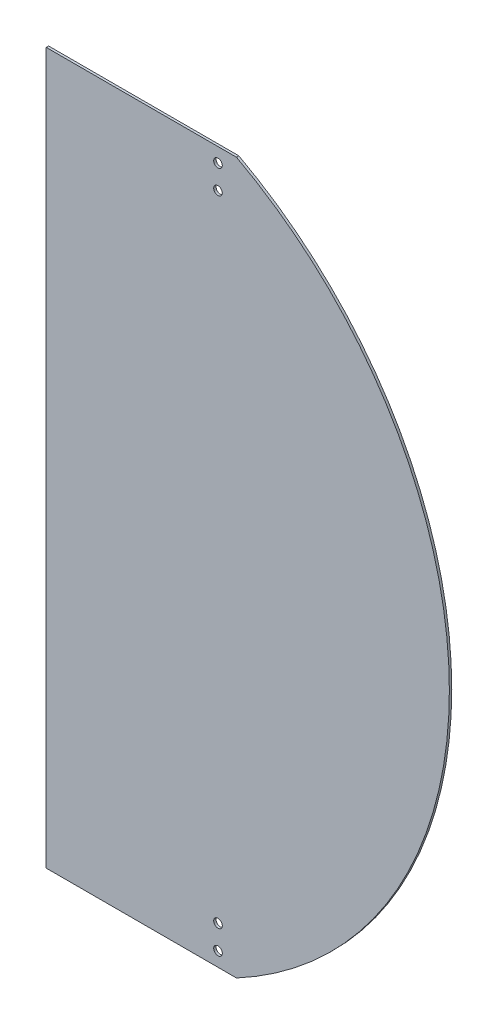
ISO-10303-21;
HEADER;
FILE_DESCRIPTION(('STEP AP214'),'2;1');
FILE_NAME('part.step','',(''),(''),'','','');
FILE_SCHEMA(('AUTOMOTIVE_DESIGN { 1 0 10303 214 1 1 1 1 }'));
ENDSEC;
DATA;
#1=APPLICATION_CONTEXT('core data for automotive mechanical design processes');
#2=APPLICATION_PROTOCOL_DEFINITION('international standard','automotive_design',2000,#1);
#3=PRODUCT_CONTEXT('',#1,'mechanical');
#4=PRODUCT('Part','Part','',(#3));
#5=PRODUCT_RELATED_PRODUCT_CATEGORY('part','',(#4));
#6=PRODUCT_DEFINITION_FORMATION('','',#4);
#7=PRODUCT_DEFINITION_CONTEXT('part definition',#1,'design');
#8=PRODUCT_DEFINITION('design','',#6,#7);
#9=PRODUCT_DEFINITION_SHAPE('','',#8);
#10=(LENGTH_UNIT() NAMED_UNIT(*) SI_UNIT(.MILLI.,.METRE.));
#11=(NAMED_UNIT(*) PLANE_ANGLE_UNIT() SI_UNIT($,.RADIAN.));
#12=(NAMED_UNIT(*) SI_UNIT($,.STERADIAN.) SOLID_ANGLE_UNIT());
#13=UNCERTAINTY_MEASURE_WITH_UNIT(LENGTH_MEASURE(1.E-05),#10,'distance_accuracy_value','');
#14=(GEOMETRIC_REPRESENTATION_CONTEXT(3) GLOBAL_UNCERTAINTY_ASSIGNED_CONTEXT((#13)) GLOBAL_UNIT_ASSIGNED_CONTEXT((#10,
#11,#12)) REPRESENTATION_CONTEXT('',''));
#15=CARTESIAN_POINT('',(0.,0.,0.));
#16=DIRECTION('',(0.,0.,1.));
#17=DIRECTION('',(1.,0.,0.));
#18=AXIS2_PLACEMENT_3D('',#15,#16,#17);
#19=CARTESIAN_POINT('',(0.,0.,2.49999999999995));
#20=DIRECTION('',(0.,0.,-1.));
#21=DIRECTION('',(-1.,0.,0.));
#22=AXIS2_PLACEMENT_3D('',#19,#20,#21);
#23=CYLINDRICAL_SURFACE('',#22,422.5);
#24=CARTESIAN_POINT('',(0.,0.,0.));
#25=DIRECTION('',(0.,0.,1.));
#26=DIRECTION('',(1.,0.,0.));
#27=AXIS2_PLACEMENT_3D('',#24,#25,#26);
#28=CIRCLE('',#27,422.5);
#29=CARTESIAN_POINT('',(199.374020373769,-372.5,0.));
#30=VERTEX_POINT('',#29);
#31=CARTESIAN_POINT('',(199.374020373769,372.5,0.));
#32=VERTEX_POINT('',#31);
#33=EDGE_CURVE('E112',#30,#32,#28,.T.);
#34=ORIENTED_EDGE('',*,*,#33,.T.);
#35=DIRECTION('',(0.,0.,-1.));
#36=VECTOR('',#35,1.);
#37=CARTESIAN_POINT('',(199.374020373769,372.5,2.49999999999995));
#38=LINE('',#37,#36);
#39=CARTESIAN_POINT('',(199.374020373769,372.5,2.49999999999995));
#40=VERTEX_POINT('',#39);
#41=EDGE_CURVE('E11',#40,#32,#38,.T.);
#42=ORIENTED_EDGE('',*,*,#41,.F.);
#43=CARTESIAN_POINT('',(0.,0.,2.49999999999995));
#44=DIRECTION('',(0.,0.,1.));
#45=DIRECTION('',(1.,0.,0.));
#46=AXIS2_PLACEMENT_3D('',#43,#44,#45);
#47=CIRCLE('',#46,422.5);
#48=CARTESIAN_POINT('',(199.374020373769,-372.5,2.50000000000006));
#49=VERTEX_POINT('',#48);
#50=EDGE_CURVE('E94',#49,#40,#47,.T.);
#51=ORIENTED_EDGE('',*,*,#50,.F.);
#52=DIRECTION('',(0.,0.,-1.));
#53=VECTOR('',#52,1.);
#54=CARTESIAN_POINT('',(199.374020373769,-372.5,2.50000000000006));
#55=LINE('',#54,#53);
#56=EDGE_CURVE('E108',#49,#30,#55,.T.);
#57=ORIENTED_EDGE('',*,*,#56,.T.);
#58=EDGE_LOOP('',(#34,#42,#51,#57));
#59=FACE_BOUND('',#58,.T.);
#60=ADVANCED_FACE('F40',(#59),#23,.T.);
#61=CARTESIAN_POINT('',(0.,372.5,2.49999999999995));
#62=DIRECTION('',(0.,-1.,0.));
#63=DIRECTION('',(0.,0.,-1.));
#64=AXIS2_PLACEMENT_3D('',#61,#62,#63);
#65=PLANE('',#64);
#66=DIRECTION('',(-1.,0.,0.));
#67=VECTOR('',#66,1.);
#68=CARTESIAN_POINT('',(0.,372.5,0.));
#69=LINE('',#68,#67);
#70=CARTESIAN_POINT('',(0.,372.5,0.));
#71=VERTEX_POINT('',#70);
#72=EDGE_CURVE('E99',#32,#71,#69,.T.);
#73=ORIENTED_EDGE('',*,*,#72,.T.);
#74=DIRECTION('',(0.,0.,-1.));
#75=VECTOR('',#74,1.);
#76=CARTESIAN_POINT('',(0.,372.5,2.49999999999995));
#77=LINE('',#76,#75);
#78=CARTESIAN_POINT('',(0.,372.5,2.49999999999995));
#79=VERTEX_POINT('',#78);
#80=EDGE_CURVE('E50',#79,#71,#77,.T.);
#81=ORIENTED_EDGE('',*,*,#80,.F.);
#82=DIRECTION('',(-1.,0.,0.));
#83=VECTOR('',#82,1.);
#84=CARTESIAN_POINT('',(0.,372.5,2.49999999999995));
#85=LINE('',#84,#83);
#86=EDGE_CURVE('E89',#40,#79,#85,.T.);
#87=ORIENTED_EDGE('',*,*,#86,.F.);
#88=ORIENTED_EDGE('',*,*,#41,.T.);
#89=EDGE_LOOP('',(#73,#81,#87,#88));
#90=FACE_BOUND('',#89,.T.);
#91=ADVANCED_FACE('F98',(#90),#65,.F.);
#92=CARTESIAN_POINT('',(0.,372.5,2.49999999999995));
#93=DIRECTION('',(1.,0.,0.));
#94=DIRECTION('',(0.,0.,-1.));
#95=AXIS2_PLACEMENT_3D('',#92,#93,#94);
#96=PLANE('',#95);
#97=DIRECTION('',(0.,-1.,0.));
#98=VECTOR('',#97,1.);
#99=CARTESIAN_POINT('',(0.,372.5,0.));
#100=LINE('',#99,#98);
#101=CARTESIAN_POINT('',(0.,-372.5,0.));
#102=VERTEX_POINT('',#101);
#103=EDGE_CURVE('E76',#71,#102,#100,.T.);
#104=ORIENTED_EDGE('',*,*,#103,.T.);
#105=DIRECTION('',(0.,0.,-1.));
#106=VECTOR('',#105,1.);
#107=CARTESIAN_POINT('',(0.,-372.5,2.50000000000006));
#108=LINE('',#107,#106);
#109=CARTESIAN_POINT('',(0.,-372.5,2.50000000000006));
#110=VERTEX_POINT('',#109);
#111=EDGE_CURVE('E101',#110,#102,#108,.T.);
#112=ORIENTED_EDGE('',*,*,#111,.F.);
#113=DIRECTION('',(0.,-1.,0.));
#114=VECTOR('',#113,1.);
#115=CARTESIAN_POINT('',(0.,372.5,2.49999999999995));
#116=LINE('',#115,#114);
#117=EDGE_CURVE('E92',#79,#110,#116,.T.);
#118=ORIENTED_EDGE('',*,*,#117,.F.);
#119=ORIENTED_EDGE('',*,*,#80,.T.);
#120=EDGE_LOOP('',(#104,#112,#118,#119));
#121=FACE_BOUND('',#120,.T.);
#122=ADVANCED_FACE('F103',(#121),#96,.F.);
#123=CARTESIAN_POINT('',(0.,-372.5,2.50000000000006));
#124=DIRECTION('',(0.,1.,0.));
#125=DIRECTION('',(0.,0.,1.));
#126=AXIS2_PLACEMENT_3D('',#123,#124,#125);
#127=PLANE('',#126);
#128=DIRECTION('',(1.,0.,0.));
#129=VECTOR('',#128,1.);
#130=CARTESIAN_POINT('',(0.,-372.5,0.));
#131=LINE('',#130,#129);
#132=EDGE_CURVE('E82',#102,#30,#131,.T.);
#133=ORIENTED_EDGE('',*,*,#132,.T.);
#134=ORIENTED_EDGE('',*,*,#56,.F.);
#135=DIRECTION('',(1.,0.,0.));
#136=VECTOR('',#135,1.);
#137=CARTESIAN_POINT('',(0.,-372.5,2.50000000000006));
#138=LINE('',#137,#136);
#139=EDGE_CURVE('E59',#110,#49,#138,.T.);
#140=ORIENTED_EDGE('',*,*,#139,.F.);
#141=ORIENTED_EDGE('',*,*,#111,.T.);
#142=EDGE_LOOP('',(#133,#134,#140,#141));
#143=FACE_BOUND('',#142,.T.);
#144=ADVANCED_FACE('F189',(#143),#127,.F.);
#145=CARTESIAN_POINT('',(0.,0.,2.49999999999995));
#146=DIRECTION('',(0.,0.,1.));
#147=DIRECTION('',(1.,0.,0.));
#148=AXIS2_PLACEMENT_3D('',#145,#146,#147);
#149=PLANE('',#148);
#150=CARTESIAN_POINT('',(180.,-357.5,2.49999999999995));
#151=DIRECTION('',(0.,0.,1.));
#152=DIRECTION('',(-1.,0.,0.));
#153=AXIS2_PLACEMENT_3D('',#150,#151,#152);
#154=CIRCLE('',#153,4.49999999999999);
#155=CARTESIAN_POINT('',(175.5,-357.5,2.49999999999995));
#156=VERTEX_POINT('',#155);
#157=EDGE_CURVE('E137',#156,#156,#154,.T.);
#158=ORIENTED_EDGE('',*,*,#157,.F.);
#159=EDGE_LOOP('',(#158));
#160=FACE_BOUND('',#159,.T.);
#161=CARTESIAN_POINT('',(180.,-332.5,2.50000000000017));
#162=DIRECTION('',(0.,0.,1.));
#163=DIRECTION('',(-1.,0.,0.));
#164=AXIS2_PLACEMENT_3D('',#161,#162,#163);
#165=CIRCLE('',#164,4.49999999999999);
#166=CARTESIAN_POINT('',(175.5,-332.5,2.50000000000017));
#167=VERTEX_POINT('',#166);
#168=EDGE_CURVE('E146',#167,#167,#165,.T.);
#169=ORIENTED_EDGE('',*,*,#168,.F.);
#170=EDGE_LOOP('',(#169));
#171=FACE_BOUND('',#170,.T.);
#172=CARTESIAN_POINT('',(180.,357.5,2.50000000000006));
#173=DIRECTION('',(0.,0.,-1.));
#174=DIRECTION('',(-1.,0.,0.));
#175=AXIS2_PLACEMENT_3D('',#172,#173,#174);
#176=CIRCLE('',#175,4.49999999999999);
#177=CARTESIAN_POINT('',(175.5,357.5,2.50000000000006));
#178=VERTEX_POINT('',#177);
#179=EDGE_CURVE('E131',#178,#178,#176,.T.);
#180=ORIENTED_EDGE('',*,*,#179,.T.);
#181=EDGE_LOOP('',(#180));
#182=FACE_BOUND('',#181,.T.);
#183=CARTESIAN_POINT('',(180.,332.5,2.50000000000006));
#184=DIRECTION('',(0.,0.,-1.));
#185=DIRECTION('',(-1.,0.,0.));
#186=AXIS2_PLACEMENT_3D('',#183,#184,#185);
#187=CIRCLE('',#186,4.49999999999999);
#188=CARTESIAN_POINT('',(175.5,332.5,2.50000000000006));
#189=VERTEX_POINT('',#188);
#190=EDGE_CURVE('E144',#189,#189,#187,.T.);
#191=ORIENTED_EDGE('',*,*,#190,.T.);
#192=EDGE_LOOP('',(#191));
#193=FACE_BOUND('',#192,.T.);
#194=ORIENTED_EDGE('',*,*,#50,.T.);
#195=ORIENTED_EDGE('',*,*,#86,.T.);
#196=ORIENTED_EDGE('',*,*,#117,.T.);
#197=ORIENTED_EDGE('',*,*,#139,.T.);
#198=EDGE_LOOP('',(#194,#195,#196,#197));
#199=FACE_BOUND('',#198,.T.);
#200=ADVANCED_FACE('F90',(#160,#171,#182,#193,#199),#149,.T.);
#201=CARTESIAN_POINT('',(0.,0.,0.));
#202=DIRECTION('',(0.,0.,1.));
#203=DIRECTION('',(1.,0.,0.));
#204=AXIS2_PLACEMENT_3D('',#201,#202,#203);
#205=PLANE('',#204);
#206=CARTESIAN_POINT('',(180.,-357.5,0.));
#207=DIRECTION('',(0.,0.,1.));
#208=DIRECTION('',(1.,0.,0.));
#209=AXIS2_PLACEMENT_3D('',#206,#207,#208);
#210=CIRCLE('',#209,4.49999999999999);
#211=CARTESIAN_POINT('',(184.5,-357.5,0.));
#212=VERTEX_POINT('',#211);
#213=EDGE_CURVE('E43',#212,#212,#210,.F.);
#214=ORIENTED_EDGE('',*,*,#213,.F.);
#215=EDGE_LOOP('',(#214));
#216=FACE_BOUND('',#215,.T.);
#217=CARTESIAN_POINT('',(180.,-332.5,2.22044604925031E-13));
#218=DIRECTION('',(0.,0.,1.));
#219=DIRECTION('',(1.,0.,0.));
#220=AXIS2_PLACEMENT_3D('',#217,#218,#219);
#221=CIRCLE('',#220,4.49999999999999);
#222=CARTESIAN_POINT('',(184.5,-332.5,2.22044604925031E-13));
#223=VERTEX_POINT('',#222);
#224=EDGE_CURVE('E134',#223,#223,#221,.F.);
#225=ORIENTED_EDGE('',*,*,#224,.F.);
#226=EDGE_LOOP('',(#225));
#227=FACE_BOUND('',#226,.T.);
#228=CARTESIAN_POINT('',(180.,357.5,0.));
#229=DIRECTION('',(0.,0.,1.));
#230=DIRECTION('',(1.,0.,0.));
#231=AXIS2_PLACEMENT_3D('',#228,#229,#230);
#232=CIRCLE('',#231,4.49999999999999);
#233=CARTESIAN_POINT('',(184.5,357.5,0.));
#234=VERTEX_POINT('',#233);
#235=EDGE_CURVE('E116',#234,#234,#232,.T.);
#236=ORIENTED_EDGE('',*,*,#235,.T.);
#237=EDGE_LOOP('',(#236));
#238=FACE_BOUND('',#237,.T.);
#239=CARTESIAN_POINT('',(180.,332.5,0.));
#240=DIRECTION('',(0.,0.,1.));
#241=DIRECTION('',(1.,0.,0.));
#242=AXIS2_PLACEMENT_3D('',#239,#240,#241);
#243=CIRCLE('',#242,4.49999999999999);
#244=CARTESIAN_POINT('',(184.5,332.5,0.));
#245=VERTEX_POINT('',#244);
#246=EDGE_CURVE('E127',#245,#245,#243,.T.);
#247=ORIENTED_EDGE('',*,*,#246,.T.);
#248=EDGE_LOOP('',(#247));
#249=FACE_BOUND('',#248,.T.);
#250=ORIENTED_EDGE('',*,*,#33,.F.);
#251=ORIENTED_EDGE('',*,*,#132,.F.);
#252=ORIENTED_EDGE('',*,*,#103,.F.);
#253=ORIENTED_EDGE('',*,*,#72,.F.);
#254=EDGE_LOOP('',(#250,#251,#252,#253));
#255=FACE_BOUND('',#254,.T.);
#256=ADVANCED_FACE('F179',(#216,#227,#238,#249,#255),#205,.F.);
#257=CARTESIAN_POINT('',(180.,332.5,2.50000000000006));
#258=DIRECTION('',(0.,0.,-1.));
#259=DIRECTION('',(-1.,0.,0.));
#260=AXIS2_PLACEMENT_3D('',#257,#258,#259);
#261=CYLINDRICAL_SURFACE('',#260,4.49999999999999);
#262=ORIENTED_EDGE('',*,*,#190,.F.);
#263=EDGE_LOOP('',(#262));
#264=FACE_BOUND('',#263,.T.);
#265=ORIENTED_EDGE('',*,*,#246,.F.);
#266=EDGE_LOOP('',(#265));
#267=FACE_BOUND('',#266,.T.);
#268=ADVANCED_FACE('F175',(#264,#267),#261,.F.);
#269=CARTESIAN_POINT('',(180.,357.5,2.50000000000006));
#270=DIRECTION('',(0.,0.,-1.));
#271=DIRECTION('',(-1.,0.,0.));
#272=AXIS2_PLACEMENT_3D('',#269,#270,#271);
#273=CYLINDRICAL_SURFACE('',#272,4.49999999999999);
#274=ORIENTED_EDGE('',*,*,#179,.F.);
#275=EDGE_LOOP('',(#274));
#276=FACE_BOUND('',#275,.T.);
#277=ORIENTED_EDGE('',*,*,#235,.F.);
#278=EDGE_LOOP('',(#277));
#279=FACE_BOUND('',#278,.T.);
#280=ADVANCED_FACE('F178',(#276,#279),#273,.F.);
#281=CARTESIAN_POINT('',(180.,-332.5,2.50000000000017));
#282=DIRECTION('',(0.,0.,-1.));
#283=DIRECTION('',(-1.,0.,0.));
#284=AXIS2_PLACEMENT_3D('',#281,#282,#283);
#285=CYLINDRICAL_SURFACE('',#284,4.49999999999999);
#286=ORIENTED_EDGE('',*,*,#168,.T.);
#287=EDGE_LOOP('',(#286));
#288=FACE_BOUND('',#287,.T.);
#289=ORIENTED_EDGE('',*,*,#224,.T.);
#290=EDGE_LOOP('',(#289));
#291=FACE_BOUND('',#290,.T.);
#292=ADVANCED_FACE('F240',(#288,#291),#285,.F.);
#293=CARTESIAN_POINT('',(180.,-357.5,2.49999999999995));
#294=DIRECTION('',(0.,0.,-1.));
#295=DIRECTION('',(-1.,0.,0.));
#296=AXIS2_PLACEMENT_3D('',#293,#294,#295);
#297=CYLINDRICAL_SURFACE('',#296,4.49999999999999);
#298=ORIENTED_EDGE('',*,*,#157,.T.);
#299=EDGE_LOOP('',(#298));
#300=FACE_BOUND('',#299,.T.);
#301=ORIENTED_EDGE('',*,*,#213,.T.);
#302=EDGE_LOOP('',(#301));
#303=FACE_BOUND('',#302,.T.);
#304=ADVANCED_FACE('F250',(#300,#303),#297,.F.);
#305=CLOSED_SHELL('',(#60,#91,#122,#144,#200,#256,#268,#280,#292,#304));
#306=MANIFOLD_SOLID_BREP('B2',#305);
#307=ADVANCED_BREP_SHAPE_REPRESENTATION('',(#18,#306),#14);
#308=SHAPE_DEFINITION_REPRESENTATION(#9,#307);
ENDSEC;
END-ISO-10303-21;
